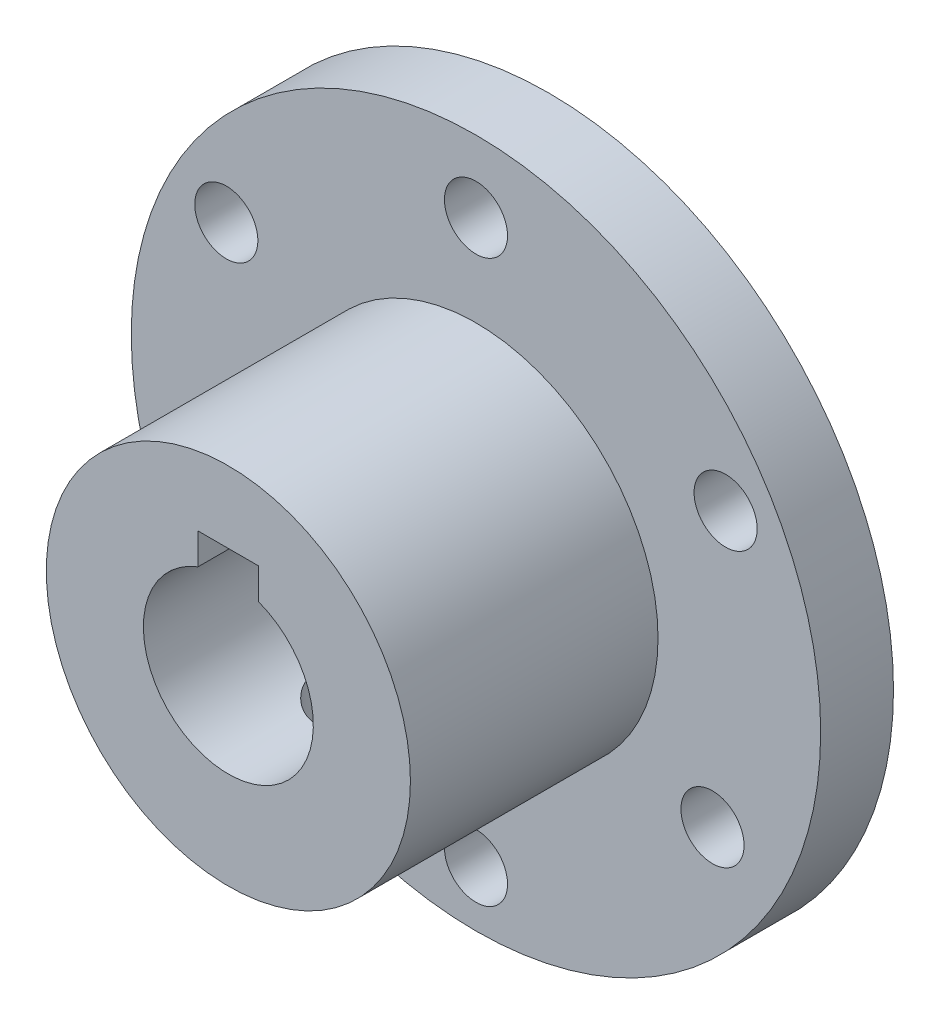
ISO-10303-21;
HEADER;
FILE_DESCRIPTION(('STEP AP214'),'2;1');
FILE_NAME('part.step','',(''),(''),'','','');
FILE_SCHEMA(('AUTOMOTIVE_DESIGN { 1 0 10303 214 1 1 1 1 }'));
ENDSEC;
DATA;
#1=APPLICATION_CONTEXT('core data for automotive mechanical design processes');
#2=APPLICATION_PROTOCOL_DEFINITION('international standard','automotive_design',2000,#1);
#3=PRODUCT_CONTEXT('',#1,'mechanical');
#4=PRODUCT('Part','Part','',(#3));
#5=PRODUCT_RELATED_PRODUCT_CATEGORY('part','',(#4));
#6=PRODUCT_DEFINITION_FORMATION('','',#4);
#7=PRODUCT_DEFINITION_CONTEXT('part definition',#1,'design');
#8=PRODUCT_DEFINITION('design','',#6,#7);
#9=PRODUCT_DEFINITION_SHAPE('','',#8);
#10=(LENGTH_UNIT() NAMED_UNIT(*) SI_UNIT(.MILLI.,.METRE.));
#11=(NAMED_UNIT(*) PLANE_ANGLE_UNIT() SI_UNIT($,.RADIAN.));
#12=(NAMED_UNIT(*) SI_UNIT($,.STERADIAN.) SOLID_ANGLE_UNIT());
#13=UNCERTAINTY_MEASURE_WITH_UNIT(LENGTH_MEASURE(1.E-05),#10,'distance_accuracy_value','');
#14=(GEOMETRIC_REPRESENTATION_CONTEXT(3) GLOBAL_UNCERTAINTY_ASSIGNED_CONTEXT((#13)) GLOBAL_UNIT_ASSIGNED_CONTEXT((#10,
#11,#12)) REPRESENTATION_CONTEXT('',''));
#15=CARTESIAN_POINT('',(0.,0.,0.));
#16=DIRECTION('',(0.,0.,1.));
#17=DIRECTION('',(1.,0.,0.));
#18=AXIS2_PLACEMENT_3D('',#15,#16,#17);
#19=CARTESIAN_POINT('',(0.,0.,20.4));
#20=DIRECTION('',(0.,0.,1.));
#21=DIRECTION('',(1.,0.,0.));
#22=AXIS2_PLACEMENT_3D('',#19,#20,#21);
#23=PLANE('',#22);
#24=DIRECTION('',(0.,-1.,0.));
#25=VECTOR('',#24,1.);
#26=CARTESIAN_POINT('',(-2.5,4.9,20.4));
#27=LINE('',#26,#25);
#28=CARTESIAN_POINT('',(-2.5,9.1,20.4));
#29=VERTEX_POINT('',#28);
#30=CARTESIAN_POINT('',(-2.5,6.53834841531101,20.4));
#31=VERTEX_POINT('',#30);
#32=EDGE_CURVE('E99',#29,#31,#27,.T.);
#33=ORIENTED_EDGE('',*,*,#32,.F.);
#34=DIRECTION('',(-1.,0.,0.));
#35=VECTOR('',#34,1.);
#36=CARTESIAN_POINT('',(2.5,9.1,20.4));
#37=LINE('',#36,#35);
#38=CARTESIAN_POINT('',(2.5,9.1,20.4));
#39=VERTEX_POINT('',#38);
#40=EDGE_CURVE('E85',#39,#29,#37,.T.);
#41=ORIENTED_EDGE('',*,*,#40,.F.);
#42=DIRECTION('',(0.,1.,0.));
#43=VECTOR('',#42,1.);
#44=CARTESIAN_POINT('',(2.5,4.9,20.4));
#45=LINE('',#44,#43);
#46=CARTESIAN_POINT('',(2.5,6.53834841531101,20.4));
#47=VERTEX_POINT('',#46);
#48=EDGE_CURVE('E92',#47,#39,#45,.T.);
#49=ORIENTED_EDGE('',*,*,#48,.F.);
#50=CARTESIAN_POINT('',(0.,0.,20.4));
#51=DIRECTION('',(0.,0.,1.));
#52=DIRECTION('',(1.,0.,0.));
#53=AXIS2_PLACEMENT_3D('',#50,#51,#52);
#54=CIRCLE('',#53,7.);
#55=EDGE_CURVE('E154',#31,#47,#54,.T.);
#56=ORIENTED_EDGE('',*,*,#55,.F.);
#57=EDGE_LOOP('',(#33,#41,#49,#56));
#58=FACE_BOUND('',#57,.T.);
#59=CARTESIAN_POINT('',(0.,0.,20.4));
#60=DIRECTION('',(0.,0.,1.));
#61=DIRECTION('',(1.,0.,0.));
#62=AXIS2_PLACEMENT_3D('',#59,#60,#61);
#63=CIRCLE('',#62,15.);
#64=CARTESIAN_POINT('',(15.,0.,20.4));
#65=VERTEX_POINT('',#64);
#66=EDGE_CURVE('E156',#65,#65,#63,.T.);
#67=ORIENTED_EDGE('',*,*,#66,.T.);
#68=EDGE_LOOP('',(#67));
#69=FACE_BOUND('',#68,.T.);
#70=ADVANCED_FACE('F36',(#58,#69),#23,.T.);
#71=CARTESIAN_POINT('',(0.,0.,20.4));
#72=DIRECTION('',(0.,0.,-1.));
#73=DIRECTION('',(-1.,0.,0.));
#74=AXIS2_PLACEMENT_3D('',#71,#72,#73);
#75=CYLINDRICAL_SURFACE('',#74,15.);
#76=CARTESIAN_POINT('',(0.,-15.,13.2));
#77=CARTESIAN_POINT('',(0.1667307203779,-14.9999969274261,13.199993866505));
#78=CARTESIAN_POINT('',(0.333538980604567,-14.9971915553469,13.1860534710971));
#79=CARTESIAN_POINT('',(0.662440523067058,-14.9862709686969,13.1307044996543));
#80=CARTESIAN_POINT('',(0.824529952624067,-14.9781515358056,13.0892741015955));
#81=CARTESIAN_POINT('',(1.13919091578994,-14.9575094783486,12.9802761791376));
#82=CARTESIAN_POINT('',(1.2917714037994,-14.9449910723015,12.9127336894659));
#83=CARTESIAN_POINT('',(1.58342396659268,-14.9169119410594,12.7535032574661));
#84=CARTESIAN_POINT('',(1.72249684522744,-14.9013513970712,12.6618167531784));
#85=CARTESIAN_POINT('',(1.9850804319446,-14.8686649598991,12.4555845171257));
#86=CARTESIAN_POINT('',(2.10838185347557,-14.8515223651304,12.3407749338264));
#87=CARTESIAN_POINT('',(2.33411026982409,-14.8177254135776,12.0921227508249));
#88=CARTESIAN_POINT('',(2.43653563431127,-14.8010710950127,11.9582786659946));
#89=CARTESIAN_POINT('',(2.61849526004286,-14.7699732543785,11.6738514209644));
#90=CARTESIAN_POINT('',(2.6978128165976,-14.7555512209484,11.5231270686109));
#91=CARTESIAN_POINT('',(2.82991699974092,-14.7307880417525,11.2101545429878));
#92=CARTESIAN_POINT('',(2.88270624731171,-14.7204464928588,11.047907509961));
#93=CARTESIAN_POINT('',(2.95957589965448,-14.7051841575661,10.7187469082762));
#94=CARTESIAN_POINT('',(2.98402349387633,-14.7001941032156,10.5519223675733));
#95=CARTESIAN_POINT('',(3.00465638317836,-14.6959912518188,10.216470535907));
#96=CARTESIAN_POINT('',(3.0008445681405,-14.6967778640352,10.0478434310396));
#97=CARTESIAN_POINT('',(2.96536371930546,-14.7039765344455,9.71625963593699));
#98=CARTESIAN_POINT('',(2.93411562073172,-14.7103035857629,9.55325578311806));
#99=CARTESIAN_POINT('',(2.84531365386915,-14.7277363848,9.23485177001099));
#100=CARTESIAN_POINT('',(2.78775852930204,-14.7388423607334,9.07945197324297));
#101=CARTESIAN_POINT('',(2.64757435102416,-14.7646685550122,8.7794542148892));
#102=CARTESIAN_POINT('',(2.56477845369634,-14.7794126944111,8.63493636129248));
#103=CARTESIAN_POINT('',(2.37658072371804,-14.8108385631919,8.36168745008156));
#104=CARTESIAN_POINT('',(2.27117629307049,-14.827520515151,8.23295820944653));
#105=CARTESIAN_POINT('',(2.03849980368175,-14.8613106372439,7.99251179262919));
#106=CARTESIAN_POINT('',(1.91086848363733,-14.8784210763271,7.88114229642261));
#107=CARTESIAN_POINT('',(1.63855507218603,-14.9108654614323,7.68133846109633));
#108=CARTESIAN_POINT('',(1.49387276213817,-14.9261993846692,7.59290441611926));
#109=CARTESIAN_POINT('',(1.19117816063676,-14.9534007048266,7.44141747232207));
#110=CARTESIAN_POINT('',(1.0331454587559,-14.9652626654482,7.37840431906639));
#111=CARTESIAN_POINT('',(0.708446929345995,-14.9841422696357,7.2799185778843));
#112=CARTESIAN_POINT('',(0.541782150217349,-14.9911605000159,7.24444265377911));
#113=CARTESIAN_POINT('',(0.207538216881452,-14.999480156006,7.20253063861717));
#114=CARTESIAN_POINT('',(0.0400209849767288,-15.0008752395741,7.19561874137919));
#115=CARTESIAN_POINT('',(-0.293774802578142,-14.9980515579031,7.20974957682654));
#116=CARTESIAN_POINT('',(-0.460053427331379,-14.9938331082434,7.23079073805779));
#117=CARTESIAN_POINT('',(-0.785116979839622,-14.9803149602405,7.29983512063187));
#118=CARTESIAN_POINT('',(-0.943955845019709,-14.9710612921262,7.34759420549371));
#119=CARTESIAN_POINT('',(-1.251370882499,-14.948506561831,7.46845194796743));
#120=CARTESIAN_POINT('',(-1.39994628491262,-14.9352051964268,7.54155250403049));
#121=CARTESIAN_POINT('',(-1.68462352105865,-14.9057973459988,7.71204747195394));
#122=CARTESIAN_POINT('',(-1.82055038025656,-14.8896585131116,7.80972834311684));
#123=CARTESIAN_POINT('',(-2.07425405735762,-14.8564420448965,8.02622757362184));
#124=CARTESIAN_POINT('',(-2.19202892679229,-14.8393643090516,8.1450481991996));
#125=CARTESIAN_POINT('',(-2.40792177232253,-14.8058791067089,8.40262005567337));
#126=CARTESIAN_POINT('',(-2.50571310734597,-14.7894858069991,8.54164723266401));
#127=CARTESIAN_POINT('',(-2.67655626015362,-14.7595257538858,8.83443408407004));
#128=CARTESIAN_POINT('',(-2.74960906776871,-14.7459588874003,8.98819316872066));
#129=CARTESIAN_POINT('',(-2.86845552474588,-14.7233022175315,9.30530473844864));
#130=CARTESIAN_POINT('',(-2.91439049937315,-14.7141892461656,9.46860252363096));
#131=CARTESIAN_POINT('',(-2.97812595488159,-14.7014231037608,9.80080036047271));
#132=CARTESIAN_POINT('',(-2.99593010467534,-14.6977692207333,9.96969967862804));
#133=CARTESIAN_POINT('',(-3.00276273260241,-14.6963744889414,10.305026593633));
#134=CARTESIAN_POINT('',(-2.99230736421269,-14.698527575679,10.471443446781));
#135=CARTESIAN_POINT('',(-2.94405691230018,-14.7082672045384,10.8000949497151));
#136=CARTESIAN_POINT('',(-2.90626204838789,-14.7158537030151,10.9623296330844));
#137=CARTESIAN_POINT('',(-2.80463570549686,-14.7355579265748,11.2776831337216));
#138=CARTESIAN_POINT('',(-2.74086752015203,-14.7476646305649,11.4308230815072));
#139=CARTESIAN_POINT('',(-2.58916393380481,-14.7750514492251,11.7243111622033));
#140=CARTESIAN_POINT('',(-2.50122650632465,-14.7903318299668,11.8646582211754));
#141=CARTESIAN_POINT('',(-2.30191774435924,-14.8226688156968,12.1311467164509));
#142=CARTESIAN_POINT('',(-2.19017366170554,-14.839751187291,12.2570062958028));
#143=CARTESIAN_POINT('',(-1.94719310703942,-14.8735824561586,12.4883586165875));
#144=CARTESIAN_POINT('',(-1.81595216146,-14.8903312758955,12.5938466709518));
#145=CARTESIAN_POINT('',(-1.53605288726474,-14.9218149716391,12.7825039318393));
#146=CARTESIAN_POINT('',(-1.3872266532895,-14.9365269365774,12.8654280098401));
#147=CARTESIAN_POINT('',(-1.0774990828222,-14.96205375255,13.0049583677898));
#148=CARTESIAN_POINT('',(-0.916608782589379,-14.9728721141585,13.0615883685975));
#149=CARTESIAN_POINT('',(-0.629464466771338,-14.9872911778611,13.1359558441341));
#150=CARTESIAN_POINT('',(-0.504844992041353,-14.9920290947535,13.1599295811233));
#151=CARTESIAN_POINT('',(-0.2534985756302,-14.9983846241968,13.1919537370751));
#152=CARTESIAN_POINT('',(-0.126771701245857,-15.0000023361946,13.2000046635293));
#153=CARTESIAN_POINT('',(0.,-15.,13.2));
#154=B_SPLINE_CURVE_WITH_KNOTS('',3,(#76,#77,#78,#79,#80,#81,#82,#83,#84,#85,#86,#87,#88,#89,
#90,#91,#92,#93,#94,#95,#96,#97,#98,#99,#100,#101,#102,#103,#104,#105,#106,#107,#108,#109,#110,
#111,#112,#113,#114,#115,#116,#117,#118,#119,#120,#121,#122,#123,#124,#125,#126,#127,#128,#129,
#130,#131,#132,#133,#134,#135,#136,#137,#138,#139,#140,#141,#142,#143,#144,#145,#146,#147,#148,
#149,#150,#151,#152,#153),.UNSPECIFIED.,.T.,.F.,(4,2,2,2,2,2,2,2,2,2,2,2,2,2,2,2,2,2,2,2,2,2,2,
2,2,2,2,2,2,2,2,2,2,2,2,2,2,2,4),(0.,0.499728391983775,0.99985395207397,1.49950120575103,
1.99911870669259,2.50479801033656,3.0105167902421,3.52083585017768,4.03110448095592,
4.53468555310762,5.03821512843675,5.53415181018835,6.03011217761189,6.52942470610778,
7.02879464249011,7.53714757474052,8.04550702619461,8.55465824562072,9.06374777094108,
9.56432207028796,10.064868229736,10.5609136185217,11.0569961764807,11.5591519810008,
12.0613616503779,12.5712188573768,13.081055661704,13.5882114309817,14.0953010499124,
14.593191677031,15.0910783047783,15.5877588375933,16.084481027456,16.5896422871743,
17.0949196359879,17.6054849002691,18.1155886655256,18.4955632586968,18.8755257411299),.UNSPECIFIED.);
#155=CARTESIAN_POINT('',(0.,-15.,13.2));
#156=VERTEX_POINT('',#155);
#157=EDGE_CURVE('E170',#156,#156,#154,.T.);
#158=ORIENTED_EDGE('',*,*,#157,.T.);
#159=EDGE_LOOP('',(#158));
#160=FACE_BOUND('',#159,.T.);
#161=ORIENTED_EDGE('',*,*,#66,.F.);
#162=EDGE_LOOP('',(#161));
#163=FACE_BOUND('',#162,.T.);
#164=CARTESIAN_POINT('',(0.,0.,0.));
#165=DIRECTION('',(0.,0.,1.));
#166=DIRECTION('',(1.,0.,0.));
#167=AXIS2_PLACEMENT_3D('',#164,#165,#166);
#168=CIRCLE('',#167,15.);
#169=CARTESIAN_POINT('',(15.,0.,0.));
#170=VERTEX_POINT('',#169);
#171=EDGE_CURVE('E151',#170,#170,#168,.T.);
#172=ORIENTED_EDGE('',*,*,#171,.T.);
#173=EDGE_LOOP('',(#172));
#174=FACE_BOUND('',#173,.T.);
#175=ADVANCED_FACE('F38',(#160,#163,#174),#75,.T.);
#176=CARTESIAN_POINT('',(0.,0.,20.4));
#177=DIRECTION('',(0.,0.,-1.));
#178=DIRECTION('',(-1.,0.,0.));
#179=AXIS2_PLACEMENT_3D('',#176,#177,#178);
#180=CYLINDRICAL_SURFACE('',#179,7.);
#181=CARTESIAN_POINT('',(0.,-7.,13.2));
#182=CARTESIAN_POINT('',(0.160281740269091,-6.9999940839629,13.1999925304185));
#183=CARTESIAN_POINT('',(0.320833907522429,-6.99443250051265,13.1870786839035));
#184=CARTESIAN_POINT('',(0.637349314958984,-6.97273920628719,13.1359176345735));
#185=CARTESIAN_POINT('',(0.793299928144206,-6.95658080950724,13.0976064709267));
#186=CARTESIAN_POINT('',(1.0955347051483,-6.91541630739346,12.9973302363749));
#187=CARTESIAN_POINT('',(1.24185033642246,-6.89044089228941,12.9354471561946));
#188=CARTESIAN_POINT('',(1.5218733278968,-6.83405660276648,12.7901355814363));
#189=CARTESIAN_POINT('',(1.6555840905338,-6.80264947176647,12.7067129239082));
#190=CARTESIAN_POINT('',(1.91384144205639,-6.7346782187555,12.5160723523121));
#191=CARTESIAN_POINT('',(2.03764045493602,-6.69793895962371,12.4079047401042));
#192=CARTESIAN_POINT('',(2.26599040232609,-6.62417654338771,12.1728561314992));
#193=CARTESIAN_POINT('',(2.3705306503261,-6.5871532404671,12.0459648153973));
#194=CARTESIAN_POINT('',(2.56285686126492,-6.51482055271223,11.7689672772845));
#195=CARTESIAN_POINT('',(2.64946811752636,-6.47970460244924,11.6179895419707));
#196=CARTESIAN_POINT('',(2.79573199408101,-6.41796168635026,11.301890571811));
#197=CARTESIAN_POINT('',(2.8553992914263,-6.39133010120133,11.1367770955138));
#198=CARTESIAN_POINT('',(2.94294919918374,-6.35147799087276,10.8056992616908));
#199=CARTESIAN_POINT('',(2.97227494401776,-6.3376522143554,10.6401922982205));
#200=CARTESIAN_POINT('',(3.00280607158394,-6.32324849688131,10.3060740303897));
#201=CARTESIAN_POINT('',(3.00402828615096,-6.32266262625149,10.1374646447086));
#202=CARTESIAN_POINT('',(2.97939999510613,-6.33429573902539,9.81670009628145));
#203=CARTESIAN_POINT('',(2.95576113815072,-6.34546870930158,9.664329376668));
#204=CARTESIAN_POINT('',(2.88580772808799,-6.37758411517576,9.36597241409867));
#205=CARTESIAN_POINT('',(2.83948852833539,-6.39852855266591,9.21998748611386));
#206=CARTESIAN_POINT('',(2.7245765907069,-6.44830685655465,8.93475284856477));
#207=CARTESIAN_POINT('',(2.65551974428426,-6.47730295111391,8.79571970578185));
#208=CARTESIAN_POINT('',(2.49742304873013,-6.53988493882129,8.53065367593057));
#209=CARTESIAN_POINT('',(2.40837507480489,-6.57347269593628,8.4046261050705));
#210=CARTESIAN_POINT('',(2.20343405392229,-6.64512404535213,8.15722249637862));
#211=CARTESIAN_POINT('',(2.08584728856133,-6.68331855389208,8.03728327052803));
#212=CARTESIAN_POINT('',(1.83187332405076,-6.75734605758523,7.81832840934405));
#213=CARTESIAN_POINT('',(1.6954812162799,-6.79317843254652,7.71931825412179));
#214=CARTESIAN_POINT('',(1.40318582301271,-6.8595969368957,7.54275606719303));
#215=CARTESIAN_POINT('',(1.24687114970231,-6.89002455033727,7.46582098129442));
#216=CARTESIAN_POINT('',(0.921879694158935,-6.94097396260558,7.33984976238528));
#217=CARTESIAN_POINT('',(0.753210215657665,-6.96150156039981,7.2907972940223));
#218=CARTESIAN_POINT('',(0.42027623894137,-6.98923526893385,7.22506613954103));
#219=CARTESIAN_POINT('',(0.256457961010924,-6.99723249964589,7.20646123468561));
#220=CARTESIAN_POINT('',(-0.0721433011185075,-7.00155416651738,7.19637042359177));
#221=CARTESIAN_POINT('',(-0.236925971900556,-6.99788220531666,7.20487614746763));
#222=CARTESIAN_POINT('',(-0.553542439626671,-6.9797867632015,7.24741563205481));
#223=CARTESIAN_POINT('',(-0.705598931504217,-6.96594519473644,7.28006832144833));
#224=CARTESIAN_POINT('',(-1.00189113639242,-6.92953888009974,7.36802089423816));
#225=CARTESIAN_POINT('',(-1.14612587370002,-6.90697304848521,7.42332359572216));
#226=CARTESIAN_POINT('',(-1.42777696523888,-6.8543875151372,7.55680115950212));
#227=CARTESIAN_POINT('',(-1.56483974951836,-6.82415705388474,7.63563633022606));
#228=CARTESIAN_POINT('',(-1.82428490564705,-6.75942988391438,7.81321894447593));
#229=CARTESIAN_POINT('',(-1.94666097512992,-6.72493135648758,7.91197488802329));
#230=CARTESIAN_POINT('',(-2.18296759532595,-6.65214788697903,8.13528958784289));
#231=CARTESIAN_POINT('',(-2.29556617553686,-6.61377354998591,8.26123221006139));
#232=CARTESIAN_POINT('',(-2.49843431443676,-6.53984037690253,8.53078229863161));
#233=CARTESIAN_POINT('',(-2.58869766421195,-6.50428232556792,8.67439466037483));
#234=CARTESIAN_POINT('',(-2.74563875632303,-6.4396296928532,8.97881385295857));
#235=CARTESIAN_POINT('',(-2.81186415020233,-6.41066255987443,9.13988300904999));
#236=CARTESIAN_POINT('',(-2.91565885028324,-6.36413607530145,9.4725263267395));
#237=CARTESIAN_POINT('',(-2.95325364225748,-6.346566580073,9.64409099832457));
#238=CARTESIAN_POINT('',(-2.9961194841997,-6.32643481136621,9.97799117233295));
#239=CARTESIAN_POINT('',(-3.00374693238451,-6.3227792566546,10.1399592675106));
#240=CARTESIAN_POINT('',(-2.99282649265778,-6.32795618271386,10.4627897469115));
#241=CARTESIAN_POINT('',(-2.97428322126543,-6.33678646098226,10.6236523211193));
#242=CARTESIAN_POINT('',(-2.91356431394149,-6.3649165389077,10.9310416962734));
#243=CARTESIAN_POINT('',(-2.87266975661122,-6.38364713099396,11.0778787915707));
#244=CARTESIAN_POINT('',(-2.769702223632,-6.42898875831973,11.3626207660839));
#245=CARTESIAN_POINT('',(-2.70762322652258,-6.45560203384715,11.5005230924077));
#246=CARTESIAN_POINT('',(-2.55963250501149,-6.5157524732596,11.7728207086796));
#247=CARTESIAN_POINT('',(-2.47248232196069,-6.5496164957701,11.9064691536948));
#248=CARTESIAN_POINT('',(-2.2784960092513,-6.61959778926566,12.1579823612475));
#249=CARTESIAN_POINT('',(-2.17165243666714,-6.6557159087398,12.2758411270492));
#250=CARTESIAN_POINT('',(-1.93135048700133,-6.72955424641834,12.5020036355007));
#251=CARTESIAN_POINT('',(-1.79645724733279,-6.76717599448736,12.6088195655728));
#252=CARTESIAN_POINT('',(-1.50919760355001,-6.83696477009089,12.7984397600312));
#253=CARTESIAN_POINT('',(-1.35682332068822,-6.86912932173673,12.8812331375999));
#254=CARTESIAN_POINT('',(-1.11954532843042,-6.91035442086788,12.9845926909895));
#255=CARTESIAN_POINT('',(-1.03957288024831,-6.92286397965452,13.0154332908018));
#256=CARTESIAN_POINT('',(-0.876970802782698,-6.94533202163241,13.0702382020223));
#257=CARTESIAN_POINT('',(-0.794342461515169,-6.95529172101821,13.0942057922754));
#258=CARTESIAN_POINT('',(-0.627265567421399,-6.97234378079151,13.1349477172834));
#259=CARTESIAN_POINT('',(-0.542821986677289,-6.97944312738119,13.1517395843805));
#260=CARTESIAN_POINT('',(-0.372647906839317,-6.99059319635283,13.1780087142034));
#261=CARTESIAN_POINT('',(-0.286918376030206,-6.99464610559385,13.1874912240139));
#262=CARTESIAN_POINT('',(-0.167492669563776,-6.99807592564235,13.1955082749436));
#263=CARTESIAN_POINT('',(-0.134021137958667,-6.99879677015532,13.1971918541176));
#264=CARTESIAN_POINT('',(-0.0670370145842116,-6.99975942751561,13.1994385012841));
#265=CARTESIAN_POINT('',(-0.0335244225617061,-7.0000012373944,13.2000015623327));
#266=CARTESIAN_POINT('',(0.,-7.,13.2));
#267=B_SPLINE_CURVE_WITH_KNOTS('',3,(#181,#182,#183,#184,#185,#186,#187,#188,#189,#190,#191,
#192,#193,#194,#195,#196,#197,#198,#199,#200,#201,#202,#203,#204,#205,#206,#207,#208,#209,#210,
#211,#212,#213,#214,#215,#216,#217,#218,#219,#220,#221,#222,#223,#224,#225,#226,#227,#228,#229,
#230,#231,#232,#233,#234,#235,#236,#237,#238,#239,#240,#241,#242,#243,#244,#245,#246,#247,#248,
#249,#250,#251,#252,#253,#254,#255,#256,#257,#258,#259,#260,#261,#262,#263,#264,#265,#266),
.UNSPECIFIED.,.T.,.F.,(4,2,2,2,2,2,2,2,2,2,2,2,2,2,2,2,2,2,2,2,2,2,2,2,2,2,2,2,2,2,2,2,2,2,2,2,
2,2,2,2,2,2,4),(0.,0.480714322748849,0.962643903423346,1.44291226275142,1.92305060961531,
2.42622743558506,2.92968263421744,3.45969560860062,3.98941952228263,4.492594268281,
4.99546764377915,5.45710720323576,5.91884138089948,6.3906540887232,6.86265889892285,
7.37709837725841,7.89167239108963,8.41947244601234,8.94696296364742,9.43957347502028,
9.93203191709568,10.3983119423363,10.8646499992176,11.3455505516221,11.8266567358409,
12.3440285038672,12.8615439335848,13.3883469079738,13.9146803943341,14.3986848887267,
14.882604015318,15.341320451094,15.8001673810816,16.2874475008663,16.7749121624767,
17.3008416934143,17.8270092002163,18.0865840789243,18.3460349177801,18.6048481685098,
18.8634754544625,18.964020720529,19.0645666096629),.UNSPECIFIED.);
#268=CARTESIAN_POINT('',(0.,-7.,13.2));
#269=VERTEX_POINT('',#268);
#270=EDGE_CURVE('E41',#269,#269,#267,.T.);
#271=ORIENTED_EDGE('',*,*,#270,.F.);
#272=EDGE_LOOP('',(#271));
#273=FACE_BOUND('',#272,.T.);
#274=DIRECTION('',(0.,0.,-1.));
#275=VECTOR('',#274,1.);
#276=CARTESIAN_POINT('',(-2.5,6.53834841531101,20.4));
#277=LINE('',#276,#275);
#278=CARTESIAN_POINT('',(-2.5,6.53834841531101,-6.));
#279=VERTEX_POINT('',#278);
#280=EDGE_CURVE('E65',#31,#279,#277,.T.);
#281=ORIENTED_EDGE('',*,*,#280,.F.);
#282=ORIENTED_EDGE('',*,*,#55,.T.);
#283=DIRECTION('',(0.,0.,-1.));
#284=VECTOR('',#283,1.);
#285=CARTESIAN_POINT('',(2.5,6.53834841531101,20.4));
#286=LINE('',#285,#284);
#287=CARTESIAN_POINT('',(2.5,6.53834841531101,-6.));
#288=VERTEX_POINT('',#287);
#289=EDGE_CURVE('E95',#288,#47,#286,.F.);
#290=ORIENTED_EDGE('',*,*,#289,.F.);
#291=CARTESIAN_POINT('',(0.,0.,-6.));
#292=DIRECTION('',(0.,0.,-1.));
#293=DIRECTION('',(-1.,0.,0.));
#294=AXIS2_PLACEMENT_3D('',#291,#292,#293);
#295=CIRCLE('',#294,7.);
#296=EDGE_CURVE('E112',#288,#279,#295,.T.);
#297=ORIENTED_EDGE('',*,*,#296,.T.);
#298=EDGE_LOOP('',(#281,#282,#290,#297));
#299=FACE_BOUND('',#298,.T.);
#300=ADVANCED_FACE('F166',(#273,#299),#180,.F.);
#301=CARTESIAN_POINT('',(0.,0.,-6.));
#302=DIRECTION('',(0.,0.,-1.));
#303=DIRECTION('',(-1.,0.,0.));
#304=AXIS2_PLACEMENT_3D('',#301,#302,#303);
#305=PLANE('',#304);
#306=DIRECTION('',(0.,1.,0.));
#307=VECTOR('',#306,1.);
#308=CARTESIAN_POINT('',(-2.5,0.,-6.));
#309=LINE('',#308,#307);
#310=CARTESIAN_POINT('',(-2.5,9.1,-6.));
#311=VERTEX_POINT('',#310);
#312=EDGE_CURVE('E11',#279,#311,#309,.T.);
#313=ORIENTED_EDGE('',*,*,#312,.F.);
#314=ORIENTED_EDGE('',*,*,#296,.F.);
#315=DIRECTION('',(0.,-1.,0.));
#316=VECTOR('',#315,1.);
#317=CARTESIAN_POINT('',(2.5,0.,-6.));
#318=LINE('',#317,#316);
#319=CARTESIAN_POINT('',(2.5,9.1,-6.));
#320=VERTEX_POINT('',#319);
#321=EDGE_CURVE('E159',#320,#288,#318,.T.);
#322=ORIENTED_EDGE('',*,*,#321,.F.);
#323=DIRECTION('',(1.,0.,0.));
#324=VECTOR('',#323,1.);
#325=CARTESIAN_POINT('',(0.,9.1,-6.));
#326=LINE('',#325,#324);
#327=EDGE_CURVE('E51',#311,#320,#326,.T.);
#328=ORIENTED_EDGE('',*,*,#327,.F.);
#329=EDGE_LOOP('',(#313,#314,#322,#328));
#330=FACE_BOUND('',#329,.T.);
#331=CARTESIAN_POINT('',(0.,-23.75,-6.));
#332=DIRECTION('',(0.,0.,1.));
#333=DIRECTION('',(1.,0.,0.));
#334=AXIS2_PLACEMENT_3D('',#331,#332,#333);
#335=CIRCLE('',#334,2.6);
#336=CARTESIAN_POINT('',(2.6,-23.75,-6.));
#337=VERTEX_POINT('',#336);
#338=EDGE_CURVE('E109',#337,#337,#335,.T.);
#339=ORIENTED_EDGE('',*,*,#338,.T.);
#340=EDGE_LOOP('',(#339));
#341=FACE_BOUND('',#340,.T.);
#342=CARTESIAN_POINT('',(-20.5681033398804,11.8750000000001,-6.));
#343=DIRECTION('',(0.,0.,1.));
#344=DIRECTION('',(1.,0.,0.));
#345=AXIS2_PLACEMENT_3D('',#342,#343,#344);
#346=CIRCLE('',#345,2.6);
#347=CARTESIAN_POINT('',(-17.9681033398804,11.8750000000001,-6.));
#348=VERTEX_POINT('',#347);
#349=EDGE_CURVE('E116',#348,#348,#346,.T.);
#350=ORIENTED_EDGE('',*,*,#349,.T.);
#351=EDGE_LOOP('',(#350));
#352=FACE_BOUND('',#351,.T.);
#353=CARTESIAN_POINT('',(20.5681033398805,11.8749999999998,-6.));
#354=DIRECTION('',(0.,0.,1.));
#355=DIRECTION('',(1.,0.,0.));
#356=AXIS2_PLACEMENT_3D('',#353,#354,#355);
#357=CIRCLE('',#356,2.6);
#358=CARTESIAN_POINT('',(23.1681033398805,11.8749999999998,-6.));
#359=VERTEX_POINT('',#358);
#360=EDGE_CURVE('E122',#359,#359,#357,.T.);
#361=ORIENTED_EDGE('',*,*,#360,.T.);
#362=EDGE_LOOP('',(#361));
#363=FACE_BOUND('',#362,.T.);
#364=CARTESIAN_POINT('',(19.4855715851499,-11.25,-6.));
#365=DIRECTION('',(0.,0.,1.));
#366=DIRECTION('',(1.,0.,0.));
#367=AXIS2_PLACEMENT_3D('',#364,#365,#366);
#368=CIRCLE('',#367,2.6);
#369=CARTESIAN_POINT('',(22.0855715851499,-11.25,-6.));
#370=VERTEX_POINT('',#369);
#371=EDGE_CURVE('E128',#370,#370,#368,.T.);
#372=ORIENTED_EDGE('',*,*,#371,.T.);
#373=EDGE_LOOP('',(#372));
#374=FACE_BOUND('',#373,.T.);
#375=CARTESIAN_POINT('',(-19.4855715851499,-11.2499999999999,-6.));
#376=DIRECTION('',(0.,0.,1.));
#377=DIRECTION('',(1.,0.,0.));
#378=AXIS2_PLACEMENT_3D('',#375,#376,#377);
#379=CIRCLE('',#378,2.6);
#380=CARTESIAN_POINT('',(-16.8855715851499,-11.2499999999999,-6.));
#381=VERTEX_POINT('',#380);
#382=EDGE_CURVE('E134',#381,#381,#379,.T.);
#383=ORIENTED_EDGE('',*,*,#382,.T.);
#384=EDGE_LOOP('',(#383));
#385=FACE_BOUND('',#384,.T.);
#386=CARTESIAN_POINT('',(2.34187669256869E-13,22.5,-6.));
#387=DIRECTION('',(0.,0.,1.));
#388=DIRECTION('',(1.,0.,0.));
#389=AXIS2_PLACEMENT_3D('',#386,#387,#388);
#390=CIRCLE('',#389,2.6);
#391=CARTESIAN_POINT('',(2.60000000000023,22.5,-6.));
#392=VERTEX_POINT('',#391);
#393=EDGE_CURVE('E140',#392,#392,#390,.T.);
#394=ORIENTED_EDGE('',*,*,#393,.T.);
#395=EDGE_LOOP('',(#394));
#396=FACE_BOUND('',#395,.T.);
#397=CARTESIAN_POINT('',(0.,0.,-6.));
#398=DIRECTION('',(0.,0.,-1.));
#399=DIRECTION('',(-1.,0.,0.));
#400=AXIS2_PLACEMENT_3D('',#397,#398,#399);
#401=CIRCLE('',#400,28.4);
#402=CARTESIAN_POINT('',(-28.4,0.,-6.));
#403=VERTEX_POINT('',#402);
#404=EDGE_CURVE('E148',#403,#403,#401,.T.);
#405=ORIENTED_EDGE('',*,*,#404,.T.);
#406=EDGE_LOOP('',(#405));
#407=FACE_BOUND('',#406,.T.);
#408=ADVANCED_FACE('F167',(#330,#341,#352,#363,#374,#385,#396,#407),#305,.T.);
#409=CARTESIAN_POINT('',(0.,0.,0.));
#410=DIRECTION('',(0.,0.,-1.));
#411=DIRECTION('',(-1.,0.,0.));
#412=AXIS2_PLACEMENT_3D('',#409,#410,#411);
#413=PLANE('',#412);
#414=CARTESIAN_POINT('',(0.,-23.75,0.));
#415=DIRECTION('',(0.,0.,1.));
#416=DIRECTION('',(1.,0.,0.));
#417=AXIS2_PLACEMENT_3D('',#414,#415,#416);
#418=CIRCLE('',#417,2.6);
#419=CARTESIAN_POINT('',(2.6,-23.75,0.));
#420=VERTEX_POINT('',#419);
#421=EDGE_CURVE('E113',#420,#420,#418,.T.);
#422=ORIENTED_EDGE('',*,*,#421,.F.);
#423=EDGE_LOOP('',(#422));
#424=FACE_BOUND('',#423,.T.);
#425=CARTESIAN_POINT('',(-20.5681033398804,11.8750000000001,0.));
#426=DIRECTION('',(0.,0.,1.));
#427=DIRECTION('',(1.,0.,0.));
#428=AXIS2_PLACEMENT_3D('',#425,#426,#427);
#429=CIRCLE('',#428,2.6);
#430=CARTESIAN_POINT('',(-17.9681033398804,11.8750000000001,0.));
#431=VERTEX_POINT('',#430);
#432=EDGE_CURVE('E119',#431,#431,#429,.T.);
#433=ORIENTED_EDGE('',*,*,#432,.F.);
#434=EDGE_LOOP('',(#433));
#435=FACE_BOUND('',#434,.T.);
#436=CARTESIAN_POINT('',(20.5681033398805,11.8749999999998,0.));
#437=DIRECTION('',(0.,0.,1.));
#438=DIRECTION('',(1.,0.,0.));
#439=AXIS2_PLACEMENT_3D('',#436,#437,#438);
#440=CIRCLE('',#439,2.6);
#441=CARTESIAN_POINT('',(23.1681033398805,11.8749999999998,0.));
#442=VERTEX_POINT('',#441);
#443=EDGE_CURVE('E125',#442,#442,#440,.T.);
#444=ORIENTED_EDGE('',*,*,#443,.F.);
#445=EDGE_LOOP('',(#444));
#446=FACE_BOUND('',#445,.T.);
#447=CARTESIAN_POINT('',(19.4855715851499,-11.25,0.));
#448=DIRECTION('',(0.,0.,1.));
#449=DIRECTION('',(1.,0.,0.));
#450=AXIS2_PLACEMENT_3D('',#447,#448,#449);
#451=CIRCLE('',#450,2.6);
#452=CARTESIAN_POINT('',(22.0855715851499,-11.25,0.));
#453=VERTEX_POINT('',#452);
#454=EDGE_CURVE('E131',#453,#453,#451,.T.);
#455=ORIENTED_EDGE('',*,*,#454,.F.);
#456=EDGE_LOOP('',(#455));
#457=FACE_BOUND('',#456,.T.);
#458=CARTESIAN_POINT('',(-19.4855715851499,-11.2499999999999,0.));
#459=DIRECTION('',(0.,0.,1.));
#460=DIRECTION('',(1.,0.,0.));
#461=AXIS2_PLACEMENT_3D('',#458,#459,#460);
#462=CIRCLE('',#461,2.6);
#463=CARTESIAN_POINT('',(-16.8855715851499,-11.2499999999999,0.));
#464=VERTEX_POINT('',#463);
#465=EDGE_CURVE('E137',#464,#464,#462,.T.);
#466=ORIENTED_EDGE('',*,*,#465,.F.);
#467=EDGE_LOOP('',(#466));
#468=FACE_BOUND('',#467,.T.);
#469=CARTESIAN_POINT('',(2.34187669256869E-13,22.5,0.));
#470=DIRECTION('',(0.,0.,1.));
#471=DIRECTION('',(1.,0.,0.));
#472=AXIS2_PLACEMENT_3D('',#469,#470,#471);
#473=CIRCLE('',#472,2.6);
#474=CARTESIAN_POINT('',(2.60000000000023,22.5,0.));
#475=VERTEX_POINT('',#474);
#476=EDGE_CURVE('E108',#475,#475,#473,.T.);
#477=ORIENTED_EDGE('',*,*,#476,.F.);
#478=EDGE_LOOP('',(#477));
#479=FACE_BOUND('',#478,.T.);
#480=ORIENTED_EDGE('',*,*,#171,.F.);
#481=EDGE_LOOP('',(#480));
#482=FACE_BOUND('',#481,.T.);
#483=CARTESIAN_POINT('',(0.,0.,0.));
#484=DIRECTION('',(0.,0.,-1.));
#485=DIRECTION('',(-1.,0.,0.));
#486=AXIS2_PLACEMENT_3D('',#483,#484,#485);
#487=CIRCLE('',#486,28.4);
#488=CARTESIAN_POINT('',(-28.4,0.,0.));
#489=VERTEX_POINT('',#488);
#490=EDGE_CURVE('E147',#489,#489,#487,.T.);
#491=ORIENTED_EDGE('',*,*,#490,.F.);
#492=EDGE_LOOP('',(#491));
#493=FACE_BOUND('',#492,.T.);
#494=ADVANCED_FACE('F215',(#424,#435,#446,#457,#468,#479,#482,#493),#413,.F.);
#495=CARTESIAN_POINT('',(0.,0.,-6.));
#496=DIRECTION('',(0.,0.,1.));
#497=DIRECTION('',(1.,0.,0.));
#498=AXIS2_PLACEMENT_3D('',#495,#496,#497);
#499=CYLINDRICAL_SURFACE('',#498,28.4);
#500=ORIENTED_EDGE('',*,*,#404,.F.);
#501=EDGE_LOOP('',(#500));
#502=FACE_BOUND('',#501,.T.);
#503=ORIENTED_EDGE('',*,*,#490,.T.);
#504=EDGE_LOOP('',(#503));
#505=FACE_BOUND('',#504,.T.);
#506=ADVANCED_FACE('F211',(#502,#505),#499,.T.);
#507=CARTESIAN_POINT('',(2.34187669256869E-13,22.5,-6.));
#508=DIRECTION('',(0.,0.,1.));
#509=DIRECTION('',(1.,0.,0.));
#510=AXIS2_PLACEMENT_3D('',#507,#508,#509);
#511=CYLINDRICAL_SURFACE('',#510,2.6);
#512=ORIENTED_EDGE('',*,*,#393,.F.);
#513=EDGE_LOOP('',(#512));
#514=FACE_BOUND('',#513,.T.);
#515=ORIENTED_EDGE('',*,*,#476,.T.);
#516=EDGE_LOOP('',(#515));
#517=FACE_BOUND('',#516,.T.);
#518=ADVANCED_FACE('F207',(#514,#517),#511,.F.);
#519=CARTESIAN_POINT('',(-19.4855715851499,-11.2499999999999,-6.));
#520=DIRECTION('',(0.,0.,1.));
#521=DIRECTION('',(1.,0.,0.));
#522=AXIS2_PLACEMENT_3D('',#519,#520,#521);
#523=CYLINDRICAL_SURFACE('',#522,2.6);
#524=ORIENTED_EDGE('',*,*,#382,.F.);
#525=EDGE_LOOP('',(#524));
#526=FACE_BOUND('',#525,.T.);
#527=ORIENTED_EDGE('',*,*,#465,.T.);
#528=EDGE_LOOP('',(#527));
#529=FACE_BOUND('',#528,.T.);
#530=ADVANCED_FACE('F203',(#526,#529),#523,.F.);
#531=CARTESIAN_POINT('',(19.4855715851499,-11.25,-6.));
#532=DIRECTION('',(0.,0.,1.));
#533=DIRECTION('',(1.,0.,0.));
#534=AXIS2_PLACEMENT_3D('',#531,#532,#533);
#535=CYLINDRICAL_SURFACE('',#534,2.6);
#536=ORIENTED_EDGE('',*,*,#371,.F.);
#537=EDGE_LOOP('',(#536));
#538=FACE_BOUND('',#537,.T.);
#539=ORIENTED_EDGE('',*,*,#454,.T.);
#540=EDGE_LOOP('',(#539));
#541=FACE_BOUND('',#540,.T.);
#542=ADVANCED_FACE('F199',(#538,#541),#535,.F.);
#543=CARTESIAN_POINT('',(20.5681033398805,11.8749999999998,-6.));
#544=DIRECTION('',(0.,0.,1.));
#545=DIRECTION('',(1.,0.,0.));
#546=AXIS2_PLACEMENT_3D('',#543,#544,#545);
#547=CYLINDRICAL_SURFACE('',#546,2.6);
#548=ORIENTED_EDGE('',*,*,#360,.F.);
#549=EDGE_LOOP('',(#548));
#550=FACE_BOUND('',#549,.T.);
#551=ORIENTED_EDGE('',*,*,#443,.T.);
#552=EDGE_LOOP('',(#551));
#553=FACE_BOUND('',#552,.T.);
#554=ADVANCED_FACE('F195',(#550,#553),#547,.F.);
#555=CARTESIAN_POINT('',(-20.5681033398804,11.8750000000001,-6.));
#556=DIRECTION('',(0.,0.,1.));
#557=DIRECTION('',(1.,0.,0.));
#558=AXIS2_PLACEMENT_3D('',#555,#556,#557);
#559=CYLINDRICAL_SURFACE('',#558,2.6);
#560=ORIENTED_EDGE('',*,*,#349,.F.);
#561=EDGE_LOOP('',(#560));
#562=FACE_BOUND('',#561,.T.);
#563=ORIENTED_EDGE('',*,*,#432,.T.);
#564=EDGE_LOOP('',(#563));
#565=FACE_BOUND('',#564,.T.);
#566=ADVANCED_FACE('F191',(#562,#565),#559,.F.);
#567=CARTESIAN_POINT('',(0.,-23.75,-6.));
#568=DIRECTION('',(0.,0.,1.));
#569=DIRECTION('',(1.,0.,0.));
#570=AXIS2_PLACEMENT_3D('',#567,#568,#569);
#571=CYLINDRICAL_SURFACE('',#570,2.6);
#572=ORIENTED_EDGE('',*,*,#338,.F.);
#573=EDGE_LOOP('',(#572));
#574=FACE_BOUND('',#573,.T.);
#575=ORIENTED_EDGE('',*,*,#421,.T.);
#576=EDGE_LOOP('',(#575));
#577=FACE_BOUND('',#576,.T.);
#578=ADVANCED_FACE('F188',(#574,#577),#571,.F.);
#579=CARTESIAN_POINT('',(-2.5,4.9,-29.6));
#580=DIRECTION('',(-1.,0.,0.));
#581=DIRECTION('',(0.,0.,1.));
#582=AXIS2_PLACEMENT_3D('',#579,#580,#581);
#583=PLANE('',#582);
#584=ORIENTED_EDGE('',*,*,#280,.T.);
#585=ORIENTED_EDGE('',*,*,#312,.T.);
#586=DIRECTION('',(0.,0.,1.));
#587=VECTOR('',#586,1.);
#588=CARTESIAN_POINT('',(-2.5,9.1,-29.6));
#589=LINE('',#588,#587);
#590=EDGE_CURVE('E89',#311,#29,#589,.T.);
#591=ORIENTED_EDGE('',*,*,#590,.T.);
#592=ORIENTED_EDGE('',*,*,#32,.T.);
#593=EDGE_LOOP('',(#584,#585,#591,#592));
#594=FACE_BOUND('',#593,.T.);
#595=ADVANCED_FACE('F169',(#594),#583,.F.);
#596=CARTESIAN_POINT('',(2.5,9.1,-29.6));
#597=DIRECTION('',(0.,1.,0.));
#598=DIRECTION('',(0.,0.,1.));
#599=AXIS2_PLACEMENT_3D('',#596,#597,#598);
#600=PLANE('',#599);
#601=ORIENTED_EDGE('',*,*,#327,.T.);
#602=DIRECTION('',(0.,0.,1.));
#603=VECTOR('',#602,1.);
#604=CARTESIAN_POINT('',(2.5,9.1,-29.6));
#605=LINE('',#604,#603);
#606=EDGE_CURVE('E58',#320,#39,#605,.T.);
#607=ORIENTED_EDGE('',*,*,#606,.T.);
#608=ORIENTED_EDGE('',*,*,#40,.T.);
#609=ORIENTED_EDGE('',*,*,#590,.F.);
#610=EDGE_LOOP('',(#601,#607,#608,#609));
#611=FACE_BOUND('',#610,.T.);
#612=ADVANCED_FACE('F82',(#611),#600,.F.);
#613=CARTESIAN_POINT('',(2.5,4.9,-29.6));
#614=DIRECTION('',(1.,0.,0.));
#615=DIRECTION('',(0.,0.,-1.));
#616=AXIS2_PLACEMENT_3D('',#613,#614,#615);
#617=PLANE('',#616);
#618=ORIENTED_EDGE('',*,*,#289,.T.);
#619=ORIENTED_EDGE('',*,*,#48,.T.);
#620=ORIENTED_EDGE('',*,*,#606,.F.);
#621=ORIENTED_EDGE('',*,*,#321,.T.);
#622=EDGE_LOOP('',(#618,#619,#620,#621));
#623=FACE_BOUND('',#622,.T.);
#624=ADVANCED_FACE('F93',(#623),#617,.F.);
#625=CARTESIAN_POINT('',(0.,-20.4,10.2));
#626=DIRECTION('',(0.,1.,0.));
#627=DIRECTION('',(0.,0.,1.));
#628=AXIS2_PLACEMENT_3D('',#625,#626,#627);
#629=CYLINDRICAL_SURFACE('',#628,3.);
#630=ORIENTED_EDGE('',*,*,#270,.T.);
#631=EDGE_LOOP('',(#630));
#632=FACE_BOUND('',#631,.T.);
#633=ORIENTED_EDGE('',*,*,#157,.F.);
#634=EDGE_LOOP('',(#633));
#635=FACE_BOUND('',#634,.T.);
#636=ADVANCED_FACE('F176',(#632,#635),#629,.F.);
#637=CLOSED_SHELL('',(#70,#175,#300,#408,#494,#506,#518,#530,#542,#554,#566,#578,#595,#612,#624,#636));
#638=MANIFOLD_SOLID_BREP('B2',#637);
#639=ADVANCED_BREP_SHAPE_REPRESENTATION('',(#18,#638),#14);
#640=SHAPE_DEFINITION_REPRESENTATION(#9,#639);
ENDSEC;
END-ISO-10303-21;
